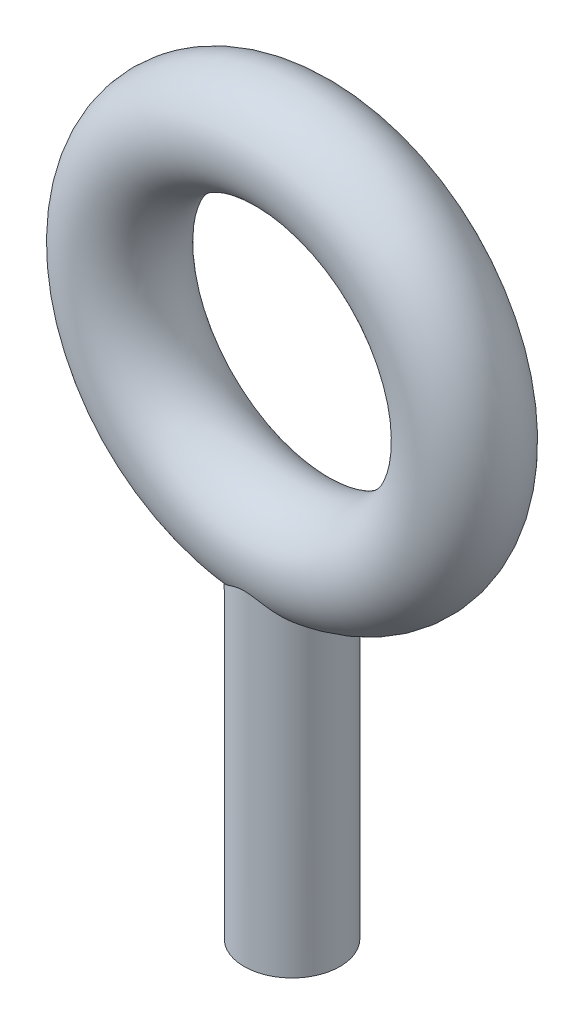
ISO-10303-21;
HEADER;
FILE_DESCRIPTION(('STEP AP214'),'2;1');
FILE_NAME('part.step','',(''),(''),'','','');
FILE_SCHEMA(('AUTOMOTIVE_DESIGN { 1 0 10303 214 1 1 1 1 }'));
ENDSEC;
DATA;
#1=APPLICATION_CONTEXT('core data for automotive mechanical design processes');
#2=APPLICATION_PROTOCOL_DEFINITION('international standard','automotive_design',2000,#1);
#3=PRODUCT_CONTEXT('',#1,'mechanical');
#4=PRODUCT('Part','Part','',(#3));
#5=PRODUCT_RELATED_PRODUCT_CATEGORY('part','',(#4));
#6=PRODUCT_DEFINITION_FORMATION('','',#4);
#7=PRODUCT_DEFINITION_CONTEXT('part definition',#1,'design');
#8=PRODUCT_DEFINITION('design','',#6,#7);
#9=PRODUCT_DEFINITION_SHAPE('','',#8);
#10=(LENGTH_UNIT() NAMED_UNIT(*) SI_UNIT(.MILLI.,.METRE.));
#11=(NAMED_UNIT(*) PLANE_ANGLE_UNIT() SI_UNIT($,.RADIAN.));
#12=(NAMED_UNIT(*) SI_UNIT($,.STERADIAN.) SOLID_ANGLE_UNIT());
#13=UNCERTAINTY_MEASURE_WITH_UNIT(LENGTH_MEASURE(1.E-05),#10,'distance_accuracy_value','');
#14=(GEOMETRIC_REPRESENTATION_CONTEXT(3) GLOBAL_UNCERTAINTY_ASSIGNED_CONTEXT((#13)) GLOBAL_UNIT_ASSIGNED_CONTEXT((#10,
#11,#12)) REPRESENTATION_CONTEXT('',''));
#15=CARTESIAN_POINT('',(0.,0.,0.));
#16=DIRECTION('',(0.,0.,1.));
#17=DIRECTION('',(1.,0.,0.));
#18=AXIS2_PLACEMENT_3D('',#15,#16,#17);
#19=CARTESIAN_POINT('',(0.,0.,0.));
#20=DIRECTION('',(0.,0.,1.));
#21=DIRECTION('',(1.,0.,0.));
#22=AXIS2_PLACEMENT_3D('',#19,#20,#21);
#23=TOROIDAL_SURFACE('',#22,15.875,4.7625);
#24=CARTESIAN_POINT('',(-3.18334869011785,-19.2659447342969,-3.05664304092332));
#25=CARTESIAN_POINT('',(-3.08520725549984,-19.195456140125,-3.15885374831986));
#26=CARTESIAN_POINT('',(-2.98300369281875,-19.1224371757501,-3.25544272208659));
#27=CARTESIAN_POINT('',(-2.77146320632803,-18.9727391863984,-3.43733046760139));
#28=CARTESIAN_POINT('',(-2.66212390909063,-18.8960589459383,-3.52262545397198));
#29=CARTESIAN_POINT('',(-2.43667603383207,-18.7404029703912,-3.68218832160037));
#30=CARTESIAN_POINT('',(-2.32055120131328,-18.6614219713128,-3.7564280750047));
#31=CARTESIAN_POINT('',(-2.08206036337605,-18.5033531147404,-3.89367739228447));
#32=CARTESIAN_POINT('',(-1.9596978329449,-18.4242653401298,-3.95669312293485));
#33=CARTESIAN_POINT('',(-1.69164280901768,-18.2582303100651,-4.07917393133311));
#34=CARTESIAN_POINT('',(-1.54500313693706,-18.1716241098012,-4.13707159067725));
#35=CARTESIAN_POINT('',(-1.3175015779446,-18.0490422142643,-4.21275642069983));
#36=CARTESIAN_POINT('',(-1.24044386447811,-18.0094175677955,-4.23611712501251));
#37=CARTESIAN_POINT('',(-1.0834785691227,-17.9339222411472,-4.27895696584173));
#38=CARTESIAN_POINT('',(-1.00357199164271,-17.8980502551219,-4.29843745473804));
#39=CARTESIAN_POINT('',(-0.811787080465899,-17.8200067314168,-4.33941180720683));
#40=CARTESIAN_POINT('',(-0.698579587280735,-17.7800812621989,-4.35918904782819));
#41=CARTESIAN_POINT('',(-0.466840539080351,-17.7159914683654,-4.39003370437951));
#42=CARTESIAN_POINT('',(-0.348330864188748,-17.6917677930023,-4.4011339513975));
#43=CARTESIAN_POINT('',(-0.106637602209662,-17.6643936227832,-4.41363242324062));
#44=CARTESIAN_POINT('',(0.0165862474403797,-17.6615149031419,-4.41490553210364));
#45=CARTESIAN_POINT('',(0.261219200099468,-17.6784512971815,-4.40722157315114));
#46=CARTESIAN_POINT('',(0.382624281920378,-17.6983108119746,-4.3982444898063));
#47=CARTESIAN_POINT('',(0.654595187868296,-17.7638911459752,-4.3671729736333));
#48=CARTESIAN_POINT('',(0.803296300592718,-17.815479761221,-4.34200839752675));
#49=CARTESIAN_POINT('',(1.09130536567191,-17.9350366742265,-4.27875654110573));
#50=CARTESIAN_POINT('',(1.23056385592844,-18.0030837966793,-4.2406067011385));
#51=CARTESIAN_POINT('',(1.49660175943668,-18.1448471669807,-4.15401619893279));
#52=CARTESIAN_POINT('',(1.62363706716366,-18.2183146455022,-4.10594095530367));
#53=CARTESIAN_POINT('',(1.87128267319161,-18.3684373239188,-3.99915856679065));
#54=CARTESIAN_POINT('',(1.9918881532934,-18.4450948397626,-3.9404435900039));
#55=CARTESIAN_POINT('',(2.22710855638734,-18.5988193834602,-3.81243774597225));
#56=CARTESIAN_POINT('',(2.34172244454083,-18.675886479539,-3.74314505984529));
#57=CARTESIAN_POINT('',(2.5648721320644,-18.8284938507638,-3.59391374623377));
#58=CARTESIAN_POINT('',(2.67340840037861,-18.9040342434207,-3.51397594173002));
#59=CARTESIAN_POINT('',(2.88767858462888,-19.0547097424052,-3.34032464954087));
#60=CARTESIAN_POINT('',(2.99317625659172,-19.1297352735674,-3.24622288396334));
#61=CARTESIAN_POINT('',(3.19627123989967,-19.2750753875729,-3.04645873335221));
#62=CARTESIAN_POINT('',(3.29386695318647,-19.3453890170084,-2.94079401998756));
#63=CARTESIAN_POINT('',(3.47968650965536,-19.4797353231338,-2.71836456295715));
#64=CARTESIAN_POINT('',(3.56793279470794,-19.5437830105596,-2.60162773563995));
#65=CARTESIAN_POINT('',(3.73384835747882,-19.6644171619128,-2.3573131073301));
#66=CARTESIAN_POINT('',(3.8115234347431,-19.7210077164056,-2.22974131348748));
#67=CARTESIAN_POINT('',(3.93188270899008,-19.8087633070891,-2.00689192183502));
#68=CARTESIAN_POINT('',(3.97782790857204,-19.8422827222768,-1.91428349817974));
#69=CARTESIAN_POINT('',(4.06356828600901,-19.904850660436,-1.72481659598971));
#70=CARTESIAN_POINT('',(4.10336501176713,-19.9339003086818,-1.62795919506184));
#71=CARTESIAN_POINT('',(4.17630843818552,-19.9871486050755,-1.43048972788706));
#72=CARTESIAN_POINT('',(4.20945608308148,-20.0113479420154,-1.32987819717416));
#73=CARTESIAN_POINT('',(4.26863503639991,-20.0545497176336,-1.1255389208866));
#74=CARTESIAN_POINT('',(4.29466957859162,-20.0735545178615,-1.02181261524039));
#75=CARTESIAN_POINT('',(4.33935904053496,-20.1061747586216,-0.81139559020075));
#76=CARTESIAN_POINT('',(4.35797686802889,-20.1197631107729,-0.704692757495797));
#77=CARTESIAN_POINT('',(4.38734053977304,-20.141193125458,-0.489679751122092));
#78=CARTESIAN_POINT('',(4.39808959077411,-20.1490371289782,-0.381370250596767));
#79=CARTESIAN_POINT('',(4.41154681394067,-20.1588572187098,-0.163981623608556));
#80=CARTESIAN_POINT('',(4.41425463620663,-20.1608330495784,-0.0549024638623472));
#81=CARTESIAN_POINT('',(4.41158220106968,-20.1588829743878,0.163098451421812));
#82=CARTESIAN_POINT('',(4.40620237585129,-20.1549573836866,0.272020215059305));
#83=CARTESIAN_POINT('',(4.38813436499462,-20.1417722384674,0.480846069993556));
#84=CARTESIAN_POINT('',(4.37601126742602,-20.1329251056126,0.580825519598241));
#85=CARTESIAN_POINT('',(4.34508060874836,-20.1103506605322,0.779196079107355));
#86=CARTESIAN_POINT('',(4.32627088523613,-20.0966217695835,0.877586664411845));
#87=CARTESIAN_POINT('',(4.26017620356357,-20.0483754180609,1.16932575520107));
#88=CARTESIAN_POINT('',(4.20320856784285,-20.006785758739,1.35943314274797));
#89=CARTESIAN_POINT('',(4.06426081936847,-19.9053542929163,1.7318598891137));
#90=CARTESIAN_POINT('',(3.98157680419194,-19.8449988510271,1.91377023288068));
#91=CARTESIAN_POINT('',(3.79547219836248,-19.709301731214,2.26050947514133));
#92=CARTESIAN_POINT('',(3.6920469752157,-19.6339567054362,2.42533454518731));
#93=CARTESIAN_POINT('',(3.45273365520189,-19.4601667609583,2.75731902622884));
#94=CARTESIAN_POINT('',(3.31434335014764,-19.35997371192,2.9217452369487));
#95=CARTESIAN_POINT('',(3.01953343506178,-19.148350826548,3.22553931193551));
#96=CARTESIAN_POINT('',(2.86309124364045,-19.0369069386348,3.3648752203638));
#97=CARTESIAN_POINT('',(2.6005110456801,-18.8533347141641,3.5678684535981));
#98=CARTESIAN_POINT('',(2.49909234627729,-18.7831848658787,3.63959378763196));
#99=CARTESIAN_POINT('',(2.29110913704344,-18.6418478259866,3.77397971013625));
#100=CARTESIAN_POINT('',(2.18454545397074,-18.570660802321,3.83664174858313));
#101=CARTESIAN_POINT('',(1.96631103606924,-18.4288492654853,3.95293414771094));
#102=CARTESIAN_POINT('',(1.85464211289617,-18.3582245630556,4.00656768111351));
#103=CARTESIAN_POINT('',(1.62579958399107,-18.2197594005601,4.10475945090726));
#104=CARTESIAN_POINT('',(1.50862970964617,-18.1519171100274,4.14932373271852));
#105=CARTESIAN_POINT('',(1.2721798172921,-18.0247303189098,4.22768174104107));
#106=CARTESIAN_POINT('',(1.15313019192175,-17.9651669456088,4.26180729114859));
#107=CARTESIAN_POINT('',(0.90798469873521,-17.8567744278247,4.32066949338137));
#108=CARTESIAN_POINT('',(0.781899824264156,-17.8079290935267,4.3454203478201));
#109=CARTESIAN_POINT('',(0.546416247012914,-17.7359582660871,4.38059193244925));
#110=CARTESIAN_POINT('',(0.43827822788134,-17.7097381666914,4.39282217133518));
#111=CARTESIAN_POINT('',(0.218778742952662,-17.6742505434237,4.40918775761412));
#112=CARTESIAN_POINT('',(0.107427541669792,-17.6649340467131,4.41334649208479));
#113=CARTESIAN_POINT('',(-0.115554023139223,-17.6653706892711,4.41314977345117));
#114=CARTESIAN_POINT('',(-0.227184235648427,-17.6751804428569,4.40876904326401));
#115=CARTESIAN_POINT('',(-0.447173105987848,-17.7116459007311,4.39193234014482));
#116=CARTESIAN_POINT('',(-0.555521126604359,-17.7383512778427,4.37945255333685));
#117=CARTESIAN_POINT('',(-0.748508365263635,-17.7980793306073,4.35020708613236));
#118=CARTESIAN_POINT('',(-0.833959576747192,-17.8291579698717,4.33458503877896));
#119=CARTESIAN_POINT('',(-1.00160977891334,-17.8971297393083,4.29894189956268));
#120=CARTESIAN_POINT('',(-1.08380609595186,-17.9340275304001,4.27891727629336));
#121=CARTESIAN_POINT('',(-1.2454475308931,-18.0118781819336,4.23470004538099));
#122=CARTESIAN_POINT('',(-1.32488170102032,-18.0528451377066,4.2104927187647));
#123=CARTESIAN_POINT('',(-1.48104428672478,-18.1373600749905,4.15813211465912));
#124=CARTESIAN_POINT('',(-1.55777175173756,-18.1809089491288,4.12997746784681));
#125=CARTESIAN_POINT('',(-1.76577455729278,-18.3030039415443,4.04712028406215));
#126=CARTESIAN_POINT('',(-1.89452516477656,-18.3831631770395,3.98841560237975));
#127=CARTESIAN_POINT('',(-2.14535798688614,-18.5445849185843,3.85928765083014));
#128=CARTESIAN_POINT('',(-2.26743618597976,-18.6258480530349,3.78885742533097));
#129=CARTESIAN_POINT('',(-2.50470815638171,-18.786920556884,3.63635238424679));
#130=CARTESIAN_POINT('',(-2.61991416091492,-18.8667323223503,3.55429919465701));
#131=CARTESIAN_POINT('',(-2.84322283219172,-19.0232427702371,3.37832198713478));
#132=CARTESIAN_POINT('',(-2.95132489319937,-19.0999411869774,3.2843969589106));
#133=CARTESIAN_POINT('',(-3.13757042846034,-19.2329892006173,3.10570312675419));
#134=CARTESIAN_POINT('',(-3.217230259598,-19.2902237777111,3.02316857643466));
#135=CARTESIAN_POINT('',(-3.37094117672563,-19.4010504369558,2.85076531642693));
#136=CARTESIAN_POINT('',(-3.44499339582738,-19.4546432547592,2.76089809609296));
#137=CARTESIAN_POINT('',(-3.5867363351123,-19.5574431290917,2.57406950022246));
#138=CARTESIAN_POINT('',(-3.65443287812821,-19.6066541978392,2.47711476578007));
#139=CARTESIAN_POINT('',(-3.78275774270601,-19.7000499280635,2.27633639320686));
#140=CARTESIAN_POINT('',(-3.84338684098238,-19.7442351418705,2.1725135118572));
#141=CARTESIAN_POINT('',(-3.94818844818963,-19.820657292626,1.97462884980803));
#142=CARTESIAN_POINT('',(-3.99346373646127,-19.8536911318808,1.88145762061659));
#143=CARTESIAN_POINT('',(-4.07779968187298,-19.9152382180247,1.69090981333725));
#144=CARTESIAN_POINT('',(-4.11686136592548,-19.9437522118988,1.5935339335345));
#145=CARTESIAN_POINT('',(-4.18827898087297,-19.9958875258478,1.39506876246882));
#146=CARTESIAN_POINT('',(-4.22063455150653,-20.0195085830677,1.293979272049));
#147=CARTESIAN_POINT('',(-4.27816828649788,-20.0615089577444,1.0887612875895));
#148=CARTESIAN_POINT('',(-4.30334984120582,-20.0798907512138,0.984634254788853));
#149=CARTESIAN_POINT('',(-4.34627429415349,-20.1112220624094,0.773519555169653));
#150=CARTESIAN_POINT('',(-4.36398108902429,-20.1241452148707,0.666520600645155));
#151=CARTESIAN_POINT('',(-4.39148636115585,-20.1442185907088,0.451017757294883));
#152=CARTESIAN_POINT('',(-4.40128816309062,-20.1513712410381,0.342514520689898));
#153=CARTESIAN_POINT('',(-4.41282948155849,-20.1597931676347,0.124852996693252));
#154=CARTESIAN_POINT('',(-4.41456913128635,-20.1610625410996,0.0156947201533335));
#155=CARTESIAN_POINT('',(-4.40995696019547,-20.1576970284829,-0.202353528403327));
#156=CARTESIAN_POINT('',(-4.40360559132329,-20.1530624721819,-0.31124351506576));
#157=CARTESIAN_POINT('',(-4.38369235361822,-20.138530569955,-0.519758014561395));
#158=CARTESIAN_POINT('',(-4.37070457761803,-20.1290522355627,-0.619467018953816));
#159=CARTESIAN_POINT('',(-4.33808680475969,-20.1052460213493,-0.81721489435071));
#160=CARTESIAN_POINT('',(-4.31845464415663,-20.090916561758,-0.915253210357483));
#161=CARTESIAN_POINT('',(-4.24996036803342,-20.0409176568993,-1.20586818696307));
#162=CARTESIAN_POINT('',(-4.1914857326625,-19.9982269449578,-1.39509410258692));
#163=CARTESIAN_POINT('',(-4.04944246836149,-19.8945386321391,-1.76627531802057));
#164=CARTESIAN_POINT('',(-3.96508055883096,-19.8329623443826,-1.94775731413332));
#165=CARTESIAN_POINT('',(-3.77576184196924,-19.6949406008886,-2.2932875128451));
#166=CARTESIAN_POINT('',(-3.6708176872325,-19.6185042803614,-2.45734633102229));
#167=CARTESIAN_POINT('',(-3.49926144451984,-19.4939795798966,-2.69102641095713));
#168=CARTESIAN_POINT('',(-3.43888644504177,-19.4502251232019,-2.76771343611799));
#169=CARTESIAN_POINT('',(-3.31407433495817,-19.3600130908571,-2.91600215930249));
#170=CARTESIAN_POINT('',(-3.24963814543001,-19.3135561283178,-2.9876050026395));
#171=CARTESIAN_POINT('',(-3.18334869011785,-19.2659447342969,-3.05664304092332));
#172=B_SPLINE_CURVE_WITH_KNOTS('',3,(#24,#25,#26,#27,#28,#29,#30,#31,#32,#33,#34,#35,#36,#37,
#38,#39,#40,#41,#42,#43,#44,#45,#46,#47,#48,#49,#50,#51,#52,#53,#54,#55,#56,#57,#58,#59,#60,#61,
#62,#63,#64,#65,#66,#67,#68,#69,#70,#71,#72,#73,#74,#75,#76,#77,#78,#79,#80,#81,#82,#83,#84,#85,
#86,#87,#88,#89,#90,#91,#92,#93,#94,#95,#96,#97,#98,#99,#100,#101,#102,#103,#104,#105,#106,#107,
#108,#109,#110,#111,#112,#113,#114,#115,#116,#117,#118,#119,#120,#121,#122,#123,#124,#125,#126,
#127,#128,#129,#130,#131,#132,#133,#134,#135,#136,#137,#138,#139,#140,#141,#142,#143,#144,#145,
#146,#147,#148,#149,#150,#151,#152,#153,#154,#155,#156,#157,#158,#159,#160,#161,#162,#163,#164,
#165,#166,#167,#168,#169,#170,#171),.UNSPECIFIED.,.T.,.F.,(4,2,2,2,2,2,2,2,2,2,2,2,2,2,2,2,2,2,
2,2,2,2,2,2,2,2,2,2,2,2,2,2,2,2,2,2,2,2,2,2,2,2,2,2,2,2,2,2,2,2,2,2,2,2,2,2,2,2,2,2,2,2,2,2,2,2,
2,2,2,2,2,2,2,4),(0.,0.474670789495016,0.949500272659104,1.42551794872302,1.90127327586347,
2.43984588867441,2.70891157991838,2.97788332839548,3.34179981228608,3.70433259137777,
4.07147352812582,4.43933260807468,4.9148542785667,5.39270010093673,5.8553657650724,
6.31837339094797,6.78146072282194,7.24451227388544,7.72400116933452,8.20358679360844,
8.68199384105903,9.16013735896593,9.48585843779609,9.8114973809357,10.137090047313,
10.4625344450357,10.7895866056821,11.1165054089325,11.4434384372549,11.7703539956802,
12.0732872629004,12.3763185856539,12.9818101367047,13.6056010732339,14.2295314872927,
14.9383467658676,15.6480585263582,16.0756945848008,16.5032621527377,16.9306791533726,
17.3578103045734,17.7694607149944,18.1804849720195,18.5150277238744,18.8485996868327,
19.1831605326948,19.5187095813369,19.795096035181,20.0717049990206,20.3493079505868,
20.6270074418293,21.1142422730872,21.601767170311,22.0883965985035,22.5750674667054,
22.959297362987,23.3434494108618,23.7272460065598,24.1110003830396,24.436857423971,
24.762660554953,25.0884811839832,25.4141475778639,25.7413694371369,26.0684536018934,
26.3955323628759,26.7225928547569,27.0252208345808,27.3279474602325,27.93295517416,
28.5587534419539,29.1841682096499,29.5048562118649,29.8254717419995),.UNSPECIFIED.);
#173=CARTESIAN_POINT('',(-3.18334869011785,-19.2659447342969,-3.05664304092332));
#174=VERTEX_POINT('',#173);
#175=EDGE_CURVE('E10',#174,#174,#172,.T.);
#176=ORIENTED_EDGE('',*,*,#175,.F.);
#177=EDGE_LOOP('',(#176));
#178=FACE_BOUND('',#177,.T.);
#179=ADVANCED_FACE('F31',(#178),#23,.T.);
#180=CARTESIAN_POINT('',(0.,-47.625,0.));
#181=DIRECTION('',(0.,1.,0.));
#182=DIRECTION('',(0.,0.,1.));
#183=AXIS2_PLACEMENT_3D('',#180,#181,#182);
#184=CYLINDRICAL_SURFACE('',#183,4.41325);
#185=ORIENTED_EDGE('',*,*,#175,.T.);
#186=EDGE_LOOP('',(#185));
#187=FACE_BOUND('',#186,.T.);
#188=CARTESIAN_POINT('',(0.,-47.625,0.));
#189=DIRECTION('',(0.,1.,0.));
#190=DIRECTION('',(0.,0.,1.));
#191=AXIS2_PLACEMENT_3D('',#188,#189,#190);
#192=CIRCLE('',#191,4.41325);
#193=CARTESIAN_POINT('',(0.,-47.625,4.41325));
#194=VERTEX_POINT('',#193);
#195=EDGE_CURVE('E41',#194,#194,#192,.T.);
#196=ORIENTED_EDGE('',*,*,#195,.T.);
#197=EDGE_LOOP('',(#196));
#198=FACE_BOUND('',#197,.T.);
#199=ADVANCED_FACE('F47',(#187,#198),#184,.T.);
#200=CARTESIAN_POINT('',(0.,-47.625,0.));
#201=DIRECTION('',(0.,1.,0.));
#202=DIRECTION('',(0.,0.,1.));
#203=AXIS2_PLACEMENT_3D('',#200,#201,#202);
#204=PLANE('',#203);
#205=ORIENTED_EDGE('',*,*,#195,.F.);
#206=EDGE_LOOP('',(#205));
#207=FACE_BOUND('',#206,.T.);
#208=ADVANCED_FACE('F49',(#207),#204,.F.);
#209=CLOSED_SHELL('',(#179,#199,#208));
#210=MANIFOLD_SOLID_BREP('B2',#209);
#211=ADVANCED_BREP_SHAPE_REPRESENTATION('',(#18,#210),#14);
#212=SHAPE_DEFINITION_REPRESENTATION(#9,#211);
ENDSEC;
END-ISO-10303-21;
